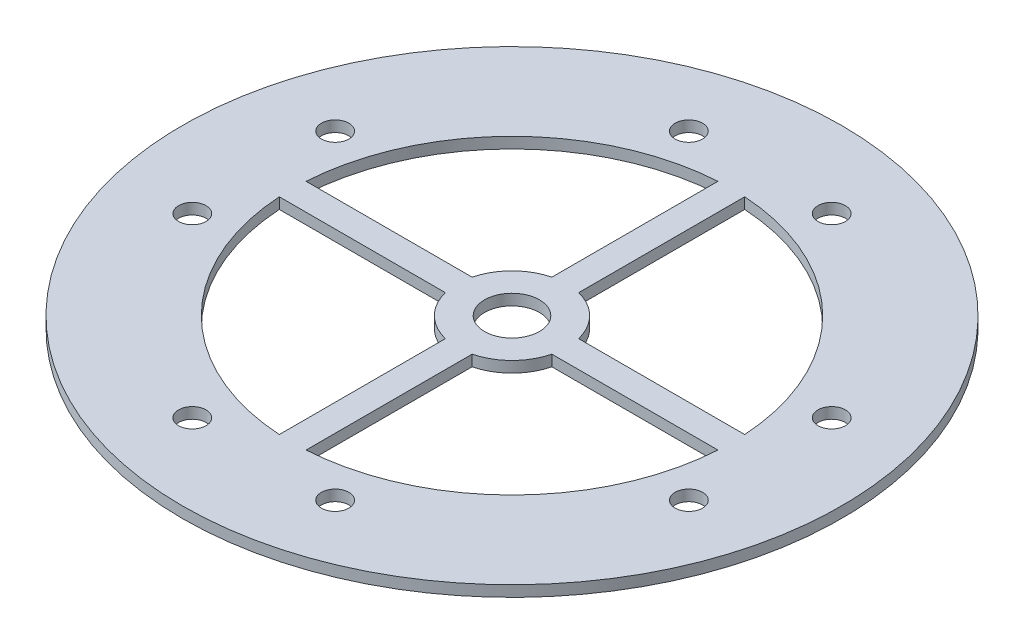
ISO-10303-21;
HEADER;
FILE_DESCRIPTION(('STEP AP214'),'2;1');
FILE_NAME('part.step','',(''),(''),'','','');
FILE_SCHEMA(('AUTOMOTIVE_DESIGN { 1 0 10303 214 1 1 1 1 }'));
ENDSEC;
DATA;
#1=APPLICATION_CONTEXT('core data for automotive mechanical design processes');
#2=APPLICATION_PROTOCOL_DEFINITION('international standard','automotive_design',2000,#1);
#3=PRODUCT_CONTEXT('',#1,'mechanical');
#4=PRODUCT('Part','Part','',(#3));
#5=PRODUCT_RELATED_PRODUCT_CATEGORY('part','',(#4));
#6=PRODUCT_DEFINITION_FORMATION('','',#4);
#7=PRODUCT_DEFINITION_CONTEXT('part definition',#1,'design');
#8=PRODUCT_DEFINITION('design','',#6,#7);
#9=PRODUCT_DEFINITION_SHAPE('','',#8);
#10=(LENGTH_UNIT() NAMED_UNIT(*) SI_UNIT(.MILLI.,.METRE.));
#11=(NAMED_UNIT(*) PLANE_ANGLE_UNIT() SI_UNIT($,.RADIAN.));
#12=(NAMED_UNIT(*) SI_UNIT($,.STERADIAN.) SOLID_ANGLE_UNIT());
#13=UNCERTAINTY_MEASURE_WITH_UNIT(LENGTH_MEASURE(1.E-05),#10,'distance_accuracy_value','');
#14=(GEOMETRIC_REPRESENTATION_CONTEXT(3) GLOBAL_UNCERTAINTY_ASSIGNED_CONTEXT((#13)) GLOBAL_UNIT_ASSIGNED_CONTEXT((#10,
#11,#12)) REPRESENTATION_CONTEXT('',''));
#15=CARTESIAN_POINT('',(0.,0.,0.));
#16=DIRECTION('',(0.,0.,1.));
#17=DIRECTION('',(1.,0.,0.));
#18=AXIS2_PLACEMENT_3D('',#15,#16,#17);
#19=CARTESIAN_POINT('',(0.,2.54,3.09938997051314));
#20=DIRECTION('',(0.,0.,1.));
#21=DIRECTION('',(1.,0.,0.));
#22=AXIS2_PLACEMENT_3D('',#19,#20,#21);
#23=PLANE('',#22);
#24=DIRECTION('',(-1.,0.,0.));
#25=VECTOR('',#24,1.);
#26=CARTESIAN_POINT('',(0.,0.,3.09938997051314));
#27=LINE('',#26,#25);
#28=CARTESIAN_POINT('',(-12.3159969880917,0.,3.09938997051301));
#29=VERTEX_POINT('',#28);
#30=CARTESIAN_POINT('',(-50.7053624561612,0.,3.09938997051261));
#31=VERTEX_POINT('',#30);
#32=EDGE_CURVE('E319',#29,#31,#27,.T.);
#33=ORIENTED_EDGE('',*,*,#32,.F.);
#34=DIRECTION('',(0.,-1.,0.));
#35=VECTOR('',#34,1.);
#36=CARTESIAN_POINT('',(-12.3159969880917,2.54,3.09938997051301));
#37=LINE('',#36,#35);
#38=CARTESIAN_POINT('',(-12.3159969880917,2.54,3.09938997051301));
#39=VERTEX_POINT('',#38);
#40=EDGE_CURVE('E11',#39,#29,#37,.T.);
#41=ORIENTED_EDGE('',*,*,#40,.F.);
#42=DIRECTION('',(-1.,0.,0.));
#43=VECTOR('',#42,1.);
#44=CARTESIAN_POINT('',(0.,2.54,3.09938997051314));
#45=LINE('',#44,#43);
#46=CARTESIAN_POINT('',(-50.7053624561612,2.54,3.09938997051261));
#47=VERTEX_POINT('',#46);
#48=EDGE_CURVE('E174',#39,#47,#45,.T.);
#49=ORIENTED_EDGE('',*,*,#48,.T.);
#50=DIRECTION('',(0.,-1.,0.));
#51=VECTOR('',#50,1.);
#52=CARTESIAN_POINT('',(-50.7053624561612,2.54,3.09938997051261));
#53=LINE('',#52,#51);
#54=EDGE_CURVE('E59',#47,#31,#53,.T.);
#55=ORIENTED_EDGE('',*,*,#54,.T.);
#56=EDGE_LOOP('',(#33,#41,#49,#55));
#57=FACE_BOUND('',#56,.T.);
#58=ADVANCED_FACE('F39',(#57),#23,.T.);
#59=CARTESIAN_POINT('',(0.,2.54,0.));
#60=DIRECTION('',(0.,-1.,0.));
#61=DIRECTION('',(0.,0.,-1.));
#62=AXIS2_PLACEMENT_3D('',#59,#60,#61);
#63=CYLINDRICAL_SURFACE('',#62,12.7);
#64=CARTESIAN_POINT('',(0.,0.,0.));
#65=DIRECTION('',(0.,1.,0.));
#66=DIRECTION('',(0.,0.,1.));
#67=AXIS2_PLACEMENT_3D('',#64,#65,#66);
#68=CIRCLE('',#67,12.7);
#69=CARTESIAN_POINT('',(-3.09938997051323,0.,12.3159969880916));
#70=VERTEX_POINT('',#69);
#71=EDGE_CURVE('E180',#29,#70,#68,.T.);
#72=ORIENTED_EDGE('',*,*,#71,.T.);
#73=DIRECTION('',(0.,-1.,0.));
#74=VECTOR('',#73,1.);
#75=CARTESIAN_POINT('',(-3.09938997051323,2.54,12.3159969880916));
#76=LINE('',#75,#74);
#77=CARTESIAN_POINT('',(-3.09938997051323,2.54,12.3159969880916));
#78=VERTEX_POINT('',#77);
#79=EDGE_CURVE('E50',#78,#70,#76,.T.);
#80=ORIENTED_EDGE('',*,*,#79,.F.);
#81=CARTESIAN_POINT('',(0.,2.54,0.));
#82=DIRECTION('',(0.,1.,0.));
#83=DIRECTION('',(0.,0.,1.));
#84=AXIS2_PLACEMENT_3D('',#81,#82,#83);
#85=CIRCLE('',#84,12.7);
#86=EDGE_CURVE('E169',#39,#78,#85,.T.);
#87=ORIENTED_EDGE('',*,*,#86,.F.);
#88=ORIENTED_EDGE('',*,*,#40,.T.);
#89=EDGE_LOOP('',(#72,#80,#87,#88));
#90=FACE_BOUND('',#89,.T.);
#91=ADVANCED_FACE('F178',(#90),#63,.T.);
#92=CARTESIAN_POINT('',(-3.0993899705137,2.54,1.1925598880297E-13));
#93=DIRECTION('',(1.,0.,0.));
#94=DIRECTION('',(0.,0.,-1.));
#95=AXIS2_PLACEMENT_3D('',#92,#93,#94);
#96=PLANE('',#95);
#97=DIRECTION('',(0.,0.,1.));
#98=VECTOR('',#97,1.);
#99=CARTESIAN_POINT('',(-3.0993899705137,0.,1.1925598880297E-13));
#100=LINE('',#99,#98);
#101=CARTESIAN_POINT('',(-3.09938997051175,0.,50.7053624561609));
#102=VERTEX_POINT('',#101);
#103=EDGE_CURVE('E324',#70,#102,#100,.T.);
#104=ORIENTED_EDGE('',*,*,#103,.T.);
#105=DIRECTION('',(0.,-1.,0.));
#106=VECTOR('',#105,1.);
#107=CARTESIAN_POINT('',(-3.09938997051175,2.54,50.7053624561609));
#108=LINE('',#107,#106);
#109=CARTESIAN_POINT('',(-3.09938997051175,2.54,50.7053624561609));
#110=VERTEX_POINT('',#109);
#111=EDGE_CURVE('E109',#110,#102,#108,.T.);
#112=ORIENTED_EDGE('',*,*,#111,.F.);
#113=DIRECTION('',(0.,0.,1.));
#114=VECTOR('',#113,1.);
#115=CARTESIAN_POINT('',(-3.0993899705137,2.54,1.1925598880297E-13));
#116=LINE('',#115,#114);
#117=EDGE_CURVE('E160',#78,#110,#116,.T.);
#118=ORIENTED_EDGE('',*,*,#117,.F.);
#119=ORIENTED_EDGE('',*,*,#79,.T.);
#120=EDGE_LOOP('',(#104,#112,#118,#119));
#121=FACE_BOUND('',#120,.T.);
#122=ADVANCED_FACE('F162',(#121),#96,.F.);
#123=CARTESIAN_POINT('',(0.,2.54,0.));
#124=DIRECTION('',(0.,-1.,0.));
#125=DIRECTION('',(0.,0.,-1.));
#126=AXIS2_PLACEMENT_3D('',#123,#124,#125);
#127=CYLINDRICAL_SURFACE('',#126,50.7999999999999);
#128=CARTESIAN_POINT('',(0.,0.,0.));
#129=DIRECTION('',(0.,1.,0.));
#130=DIRECTION('',(0.,0.,1.));
#131=AXIS2_PLACEMENT_3D('',#128,#129,#130);
#132=CIRCLE('',#131,50.7999999999999);
#133=CARTESIAN_POINT('',(3.09938997051453,0.,50.7053624561609));
#134=VERTEX_POINT('',#133);
#135=CARTESIAN_POINT('',(50.7053624561612,0.,3.09938997051332));
#136=VERTEX_POINT('',#135);
#137=EDGE_CURVE('E271',#134,#136,#132,.T.);
#138=ORIENTED_EDGE('',*,*,#137,.F.);
#139=DIRECTION('',(0.,-1.,0.));
#140=VECTOR('',#139,1.);
#141=CARTESIAN_POINT('',(3.09938997051453,2.54,50.7053624561609));
#142=LINE('',#141,#140);
#143=CARTESIAN_POINT('',(3.09938997051453,2.54,50.7053624561609));
#144=VERTEX_POINT('',#143);
#145=EDGE_CURVE('E198',#144,#134,#142,.T.);
#146=ORIENTED_EDGE('',*,*,#145,.F.);
#147=CARTESIAN_POINT('',(0.,2.54,0.));
#148=DIRECTION('',(0.,1.,0.));
#149=DIRECTION('',(0.,0.,1.));
#150=AXIS2_PLACEMENT_3D('',#147,#148,#149);
#151=CIRCLE('',#150,50.7999999999999);
#152=CARTESIAN_POINT('',(50.7053624561612,2.54,3.09938997051332));
#153=VERTEX_POINT('',#152);
#154=EDGE_CURVE('E370',#144,#153,#151,.T.);
#155=ORIENTED_EDGE('',*,*,#154,.T.);
#156=DIRECTION('',(0.,-1.,0.));
#157=VECTOR('',#156,1.);
#158=CARTESIAN_POINT('',(50.7053624561612,2.54,3.09938997051332));
#159=LINE('',#158,#157);
#160=EDGE_CURVE('E187',#153,#136,#159,.T.);
#161=ORIENTED_EDGE('',*,*,#160,.T.);
#162=EDGE_LOOP('',(#138,#146,#155,#161));
#163=FACE_BOUND('',#162,.T.);
#164=ADVANCED_FACE('F495',(#163),#127,.F.);
#165=CARTESIAN_POINT('',(3.09938997051258,2.54,-1.19255988802927E-13));
#166=DIRECTION('',(1.,0.,0.));
#167=DIRECTION('',(0.,0.,-1.));
#168=AXIS2_PLACEMENT_3D('',#165,#166,#167);
#169=PLANE('',#168);
#170=DIRECTION('',(0.,0.,1.));
#171=VECTOR('',#170,1.);
#172=CARTESIAN_POINT('',(3.09938997051258,0.,-1.19255988802927E-13));
#173=LINE('',#172,#171);
#174=CARTESIAN_POINT('',(3.09938997051305,0.,12.3159969880917));
#175=VERTEX_POINT('',#174);
#176=EDGE_CURVE('E275',#175,#134,#173,.T.);
#177=ORIENTED_EDGE('',*,*,#176,.F.);
#178=DIRECTION('',(0.,-1.,0.));
#179=VECTOR('',#178,1.);
#180=CARTESIAN_POINT('',(3.09938997051305,2.54,12.3159969880917));
#181=LINE('',#180,#179);
#182=CARTESIAN_POINT('',(3.09938997051305,2.54,12.3159969880917));
#183=VERTEX_POINT('',#182);
#184=EDGE_CURVE('E195',#183,#175,#181,.T.);
#185=ORIENTED_EDGE('',*,*,#184,.F.);
#186=DIRECTION('',(0.,0.,1.));
#187=VECTOR('',#186,1.);
#188=CARTESIAN_POINT('',(3.09938997051258,2.54,-1.19255988802927E-13));
#189=LINE('',#188,#187);
#190=EDGE_CURVE('E374',#183,#144,#189,.T.);
#191=ORIENTED_EDGE('',*,*,#190,.T.);
#192=ORIENTED_EDGE('',*,*,#145,.T.);
#193=EDGE_LOOP('',(#177,#185,#191,#192));
#194=FACE_BOUND('',#193,.T.);
#195=ADVANCED_FACE('F491',(#194),#169,.T.);
#196=CARTESIAN_POINT('',(0.,2.54,0.));
#197=DIRECTION('',(0.,-1.,0.));
#198=DIRECTION('',(0.,0.,-1.));
#199=AXIS2_PLACEMENT_3D('',#196,#197,#198);
#200=CYLINDRICAL_SURFACE('',#199,12.7);
#201=CARTESIAN_POINT('',(0.,0.,0.));
#202=DIRECTION('',(0.,1.,0.));
#203=DIRECTION('',(0.,0.,1.));
#204=AXIS2_PLACEMENT_3D('',#201,#202,#203);
#205=CIRCLE('',#204,12.7);
#206=CARTESIAN_POINT('',(12.3159969880916,0.,3.09938997051318));
#207=VERTEX_POINT('',#206);
#208=EDGE_CURVE('E279',#175,#207,#205,.T.);
#209=ORIENTED_EDGE('',*,*,#208,.T.);
#210=DIRECTION('',(0.,-1.,0.));
#211=VECTOR('',#210,1.);
#212=CARTESIAN_POINT('',(12.3159969880916,2.54,3.09938997051318));
#213=LINE('',#212,#211);
#214=CARTESIAN_POINT('',(12.3159969880916,2.54,3.09938997051318));
#215=VERTEX_POINT('',#214);
#216=EDGE_CURVE('E190',#215,#207,#213,.T.);
#217=ORIENTED_EDGE('',*,*,#216,.F.);
#218=CARTESIAN_POINT('',(0.,2.54,0.));
#219=DIRECTION('',(0.,1.,0.));
#220=DIRECTION('',(0.,0.,1.));
#221=AXIS2_PLACEMENT_3D('',#218,#219,#220);
#222=CIRCLE('',#221,12.7);
#223=EDGE_CURVE('E378',#183,#215,#222,.T.);
#224=ORIENTED_EDGE('',*,*,#223,.F.);
#225=ORIENTED_EDGE('',*,*,#184,.T.);
#226=EDGE_LOOP('',(#209,#217,#224,#225));
#227=FACE_BOUND('',#226,.T.);
#228=ADVANCED_FACE('F487',(#227),#200,.T.);
#229=CARTESIAN_POINT('',(0.,2.54,0.));
#230=DIRECTION('',(0.,-1.,0.));
#231=DIRECTION('',(0.,0.,-1.));
#232=AXIS2_PLACEMENT_3D('',#229,#230,#231);
#233=CYLINDRICAL_SURFACE('',#232,50.8);
#234=CARTESIAN_POINT('',(0.,0.,0.));
#235=DIRECTION('',(0.,1.,0.));
#236=DIRECTION('',(0.,0.,1.));
#237=AXIS2_PLACEMENT_3D('',#234,#235,#236);
#238=CIRCLE('',#237,50.8);
#239=CARTESIAN_POINT('',(50.7053624561612,0.,-3.09938997051296));
#240=VERTEX_POINT('',#239);
#241=CARTESIAN_POINT('',(3.09938997051314,0.,-50.7053624561612));
#242=VERTEX_POINT('',#241);
#243=EDGE_CURVE('E255',#240,#242,#238,.T.);
#244=ORIENTED_EDGE('',*,*,#243,.F.);
#245=DIRECTION('',(0.,-1.,0.));
#246=VECTOR('',#245,1.);
#247=CARTESIAN_POINT('',(50.7053624561612,2.54,-3.09938997051296));
#248=LINE('',#247,#246);
#249=CARTESIAN_POINT('',(50.7053624561612,2.54,-3.09938997051296));
#250=VERTEX_POINT('',#249);
#251=EDGE_CURVE('E191',#250,#240,#248,.T.);
#252=ORIENTED_EDGE('',*,*,#251,.F.);
#253=CARTESIAN_POINT('',(0.,2.54,0.));
#254=DIRECTION('',(0.,1.,0.));
#255=DIRECTION('',(0.,0.,1.));
#256=AXIS2_PLACEMENT_3D('',#253,#254,#255);
#257=CIRCLE('',#256,50.8);
#258=CARTESIAN_POINT('',(3.09938997051314,2.54,-50.7053624561612));
#259=VERTEX_POINT('',#258);
#260=EDGE_CURVE('E355',#250,#259,#257,.T.);
#261=ORIENTED_EDGE('',*,*,#260,.T.);
#262=DIRECTION('',(0.,-1.,0.));
#263=VECTOR('',#262,1.);
#264=CARTESIAN_POINT('',(3.09938997051314,2.54,-50.7053624561612));
#265=LINE('',#264,#263);
#266=EDGE_CURVE('E201',#259,#242,#265,.T.);
#267=ORIENTED_EDGE('',*,*,#266,.T.);
#268=EDGE_LOOP('',(#244,#252,#261,#267));
#269=FACE_BOUND('',#268,.T.);
#270=ADVANCED_FACE('F490',(#269),#233,.F.);
#271=CARTESIAN_POINT('',(0.,2.54,-3.09938997051314));
#272=DIRECTION('',(0.,0.,-1.));
#273=DIRECTION('',(-1.,0.,0.));
#274=AXIS2_PLACEMENT_3D('',#271,#272,#273);
#275=PLANE('',#274);
#276=DIRECTION('',(1.,0.,0.));
#277=VECTOR('',#276,1.);
#278=CARTESIAN_POINT('',(0.,0.,-3.09938997051314));
#279=LINE('',#278,#277);
#280=CARTESIAN_POINT('',(12.3159969880917,0.,-3.0993899705131));
#281=VERTEX_POINT('',#280);
#282=EDGE_CURVE('E259',#281,#240,#279,.T.);
#283=ORIENTED_EDGE('',*,*,#282,.F.);
#284=DIRECTION('',(0.,-1.,0.));
#285=VECTOR('',#284,1.);
#286=CARTESIAN_POINT('',(12.3159969880917,2.54,-3.0993899705131));
#287=LINE('',#286,#285);
#288=CARTESIAN_POINT('',(12.3159969880917,2.54,-3.0993899705131));
#289=VERTEX_POINT('',#288);
#290=EDGE_CURVE('E208',#289,#281,#287,.T.);
#291=ORIENTED_EDGE('',*,*,#290,.F.);
#292=DIRECTION('',(1.,0.,0.));
#293=VECTOR('',#292,1.);
#294=CARTESIAN_POINT('',(0.,2.54,-3.09938997051314));
#295=LINE('',#294,#293);
#296=EDGE_CURVE('E359',#289,#250,#295,.T.);
#297=ORIENTED_EDGE('',*,*,#296,.T.);
#298=ORIENTED_EDGE('',*,*,#251,.T.);
#299=EDGE_LOOP('',(#283,#291,#297,#298));
#300=FACE_BOUND('',#299,.T.);
#301=ADVANCED_FACE('F506',(#300),#275,.T.);
#302=CARTESIAN_POINT('',(0.,2.54,0.));
#303=DIRECTION('',(0.,-1.,0.));
#304=DIRECTION('',(0.,0.,-1.));
#305=AXIS2_PLACEMENT_3D('',#302,#303,#304);
#306=CYLINDRICAL_SURFACE('',#305,12.7);
#307=CARTESIAN_POINT('',(0.,0.,0.));
#308=DIRECTION('',(0.,1.,0.));
#309=DIRECTION('',(0.,0.,1.));
#310=AXIS2_PLACEMENT_3D('',#307,#308,#309);
#311=CIRCLE('',#310,12.7);
#312=CARTESIAN_POINT('',(3.09938997051314,0.,-12.3159969880916));
#313=VERTEX_POINT('',#312);
#314=EDGE_CURVE('E263',#281,#313,#311,.T.);
#315=ORIENTED_EDGE('',*,*,#314,.T.);
#316=DIRECTION('',(0.,-1.,0.));
#317=VECTOR('',#316,1.);
#318=CARTESIAN_POINT('',(3.09938997051314,2.54,-12.3159969880916));
#319=LINE('',#318,#317);
#320=CARTESIAN_POINT('',(3.09938997051314,2.54,-12.3159969880916));
#321=VERTEX_POINT('',#320);
#322=EDGE_CURVE('E204',#321,#313,#319,.T.);
#323=ORIENTED_EDGE('',*,*,#322,.F.);
#324=CARTESIAN_POINT('',(0.,2.54,0.));
#325=DIRECTION('',(0.,1.,0.));
#326=DIRECTION('',(0.,0.,1.));
#327=AXIS2_PLACEMENT_3D('',#324,#325,#326);
#328=CIRCLE('',#327,12.7);
#329=EDGE_CURVE('E363',#289,#321,#328,.T.);
#330=ORIENTED_EDGE('',*,*,#329,.F.);
#331=ORIENTED_EDGE('',*,*,#290,.T.);
#332=EDGE_LOOP('',(#315,#323,#330,#331));
#333=FACE_BOUND('',#332,.T.);
#334=ADVANCED_FACE('F503',(#333),#306,.T.);
#335=CARTESIAN_POINT('',(0.,2.54,0.));
#336=DIRECTION('',(0.,-1.,0.));
#337=DIRECTION('',(0.,0.,-1.));
#338=AXIS2_PLACEMENT_3D('',#335,#336,#337);
#339=CYLINDRICAL_SURFACE('',#338,50.8);
#340=CARTESIAN_POINT('',(0.,0.,0.));
#341=DIRECTION('',(0.,1.,0.));
#342=DIRECTION('',(0.,0.,1.));
#343=AXIS2_PLACEMENT_3D('',#340,#341,#342);
#344=CIRCLE('',#343,50.8);
#345=CARTESIAN_POINT('',(-3.09938997051314,0.,-50.7053624561612));
#346=VERTEX_POINT('',#345);
#347=CARTESIAN_POINT('',(-50.7053624561612,0.,-3.09938997051367));
#348=VERTEX_POINT('',#347);
#349=EDGE_CURVE('E235',#346,#348,#344,.T.);
#350=ORIENTED_EDGE('',*,*,#349,.F.);
#351=DIRECTION('',(0.,-1.,0.));
#352=VECTOR('',#351,1.);
#353=CARTESIAN_POINT('',(-3.09938997051314,2.54,-50.7053624561612));
#354=LINE('',#353,#352);
#355=CARTESIAN_POINT('',(-3.09938997051314,2.54,-50.7053624561612));
#356=VERTEX_POINT('',#355);
#357=EDGE_CURVE('E43',#356,#346,#354,.T.);
#358=ORIENTED_EDGE('',*,*,#357,.F.);
#359=CARTESIAN_POINT('',(0.,2.54,0.));
#360=DIRECTION('',(0.,1.,0.));
#361=DIRECTION('',(0.,0.,1.));
#362=AXIS2_PLACEMENT_3D('',#359,#360,#361);
#363=CIRCLE('',#362,50.8);
#364=CARTESIAN_POINT('',(-50.7053624561612,2.54,-3.09938997051367));
#365=VERTEX_POINT('',#364);
#366=EDGE_CURVE('E341',#356,#365,#363,.T.);
#367=ORIENTED_EDGE('',*,*,#366,.T.);
#368=DIRECTION('',(0.,-1.,0.));
#369=VECTOR('',#368,1.);
#370=CARTESIAN_POINT('',(-50.7053624561612,2.54,-3.09938997051367));
#371=LINE('',#370,#369);
#372=EDGE_CURVE('E213',#365,#348,#371,.T.);
#373=ORIENTED_EDGE('',*,*,#372,.T.);
#374=EDGE_LOOP('',(#350,#358,#367,#373));
#375=FACE_BOUND('',#374,.T.);
#376=ADVANCED_FACE('F236',(#375),#339,.F.);
#377=CARTESIAN_POINT('',(-3.09938997051314,2.54,0.));
#378=DIRECTION('',(-1.,0.,0.));
#379=DIRECTION('',(0.,0.,1.));
#380=AXIS2_PLACEMENT_3D('',#377,#378,#379);
#381=PLANE('',#380);
#382=DIRECTION('',(0.,0.,-1.));
#383=VECTOR('',#382,1.);
#384=CARTESIAN_POINT('',(-3.09938997051314,0.,0.));
#385=LINE('',#384,#383);
#386=CARTESIAN_POINT('',(-3.09938997051314,0.,-12.3159969880916));
#387=VERTEX_POINT('',#386);
#388=EDGE_CURVE('E231',#387,#346,#385,.T.);
#389=ORIENTED_EDGE('',*,*,#388,.F.);
#390=DIRECTION('',(0.,-1.,0.));
#391=VECTOR('',#390,1.);
#392=CARTESIAN_POINT('',(-3.09938997051314,2.54,-12.3159969880916));
#393=LINE('',#392,#391);
#394=CARTESIAN_POINT('',(-3.09938997051314,2.54,-12.3159969880916));
#395=VERTEX_POINT('',#394);
#396=EDGE_CURVE('E219',#395,#387,#393,.T.);
#397=ORIENTED_EDGE('',*,*,#396,.F.);
#398=DIRECTION('',(0.,0.,-1.));
#399=VECTOR('',#398,1.);
#400=CARTESIAN_POINT('',(-3.09938997051314,2.54,0.));
#401=LINE('',#400,#399);
#402=EDGE_CURVE('E233',#395,#356,#401,.T.);
#403=ORIENTED_EDGE('',*,*,#402,.T.);
#404=ORIENTED_EDGE('',*,*,#357,.T.);
#405=EDGE_LOOP('',(#389,#397,#403,#404));
#406=FACE_BOUND('',#405,.T.);
#407=ADVANCED_FACE('F229',(#406),#381,.T.);
#408=CARTESIAN_POINT('',(0.,2.54,0.));
#409=DIRECTION('',(0.,-1.,0.));
#410=DIRECTION('',(0.,0.,-1.));
#411=AXIS2_PLACEMENT_3D('',#408,#409,#410);
#412=CYLINDRICAL_SURFACE('',#411,12.7);
#413=CARTESIAN_POINT('',(0.,0.,0.));
#414=DIRECTION('',(0.,1.,0.));
#415=DIRECTION('',(0.,0.,1.));
#416=AXIS2_PLACEMENT_3D('',#413,#414,#415);
#417=CIRCLE('',#416,12.7);
#418=CARTESIAN_POINT('',(-12.3159969880916,0.,-3.09938997051327));
#419=VERTEX_POINT('',#418);
#420=EDGE_CURVE('E245',#387,#419,#417,.T.);
#421=ORIENTED_EDGE('',*,*,#420,.T.);
#422=DIRECTION('',(0.,-1.,0.));
#423=VECTOR('',#422,1.);
#424=CARTESIAN_POINT('',(-12.3159969880916,2.54,-3.09938997051327));
#425=LINE('',#424,#423);
#426=CARTESIAN_POINT('',(-12.3159969880916,2.54,-3.09938997051327));
#427=VERTEX_POINT('',#426);
#428=EDGE_CURVE('E216',#427,#419,#425,.T.);
#429=ORIENTED_EDGE('',*,*,#428,.F.);
#430=CARTESIAN_POINT('',(0.,2.54,0.));
#431=DIRECTION('',(0.,1.,0.));
#432=DIRECTION('',(0.,0.,1.));
#433=AXIS2_PLACEMENT_3D('',#430,#431,#432);
#434=CIRCLE('',#433,12.7);
#435=EDGE_CURVE('E348',#395,#427,#434,.T.);
#436=ORIENTED_EDGE('',*,*,#435,.F.);
#437=ORIENTED_EDGE('',*,*,#396,.T.);
#438=EDGE_LOOP('',(#421,#429,#436,#437));
#439=FACE_BOUND('',#438,.T.);
#440=ADVANCED_FACE('F454',(#439),#412,.T.);
#441=CARTESIAN_POINT('',(0.,2.54,0.));
#442=DIRECTION('',(0.,-1.,0.));
#443=DIRECTION('',(0.,0.,-1.));
#444=AXIS2_PLACEMENT_3D('',#441,#442,#443);
#445=CYLINDRICAL_SURFACE('',#444,76.2);
#446=CARTESIAN_POINT('',(0.,2.54,0.));
#447=DIRECTION('',(0.,1.,0.));
#448=DIRECTION('',(0.,0.,1.));
#449=AXIS2_PLACEMENT_3D('',#446,#447,#448);
#450=CIRCLE('',#449,76.2);
#451=CARTESIAN_POINT('',(0.,2.54,76.2));
#452=VERTEX_POINT('',#451);
#453=EDGE_CURVE('E413',#452,#452,#450,.T.);
#454=ORIENTED_EDGE('',*,*,#453,.F.);
#455=EDGE_LOOP('',(#454));
#456=FACE_BOUND('',#455,.T.);
#457=CARTESIAN_POINT('',(0.,0.,0.));
#458=DIRECTION('',(0.,1.,0.));
#459=DIRECTION('',(0.,0.,1.));
#460=AXIS2_PLACEMENT_3D('',#457,#458,#459);
#461=CIRCLE('',#460,76.2);
#462=CARTESIAN_POINT('',(0.,0.,76.2));
#463=VERTEX_POINT('',#462);
#464=EDGE_CURVE('E315',#463,#463,#461,.T.);
#465=ORIENTED_EDGE('',*,*,#464,.T.);
#466=EDGE_LOOP('',(#465));
#467=FACE_BOUND('',#466,.T.);
#468=ADVANCED_FACE('F450',(#456,#467),#445,.T.);
#469=CARTESIAN_POINT('',(57.4040000000042,2.54,16.5099999999977));
#470=DIRECTION('',(0.,-1.,0.));
#471=DIRECTION('',(0.,0.,-1.));
#472=AXIS2_PLACEMENT_3D('',#469,#470,#471);
#473=CYLINDRICAL_SURFACE('',#472,3.17500000000117);
#474=CARTESIAN_POINT('',(57.4040000000042,2.54,16.5099999999977));
#475=DIRECTION('',(0.,1.,0.));
#476=DIRECTION('',(0.,0.,1.));
#477=AXIS2_PLACEMENT_3D('',#474,#475,#476);
#478=CIRCLE('',#477,3.17500000000117);
#479=CARTESIAN_POINT('',(57.4040000000042,2.54,19.6849999999989));
#480=VERTEX_POINT('',#479);
#481=EDGE_CURVE('E409',#480,#480,#478,.T.);
#482=ORIENTED_EDGE('',*,*,#481,.T.);
#483=EDGE_LOOP('',(#482));
#484=FACE_BOUND('',#483,.T.);
#485=CARTESIAN_POINT('',(57.4040000000042,0.,16.5099999999977));
#486=DIRECTION('',(0.,1.,0.));
#487=DIRECTION('',(0.,0.,1.));
#488=AXIS2_PLACEMENT_3D('',#485,#486,#487);
#489=CIRCLE('',#488,3.17500000000117);
#490=CARTESIAN_POINT('',(57.4040000000042,0.,19.6849999999989));
#491=VERTEX_POINT('',#490);
#492=EDGE_CURVE('E311',#491,#491,#489,.T.);
#493=ORIENTED_EDGE('',*,*,#492,.F.);
#494=EDGE_LOOP('',(#493));
#495=FACE_BOUND('',#494,.T.);
#496=ADVANCED_FACE('F453',(#484,#495),#473,.F.);
#497=CARTESIAN_POINT('',(57.4040000000042,2.54,-16.5100000000023));
#498=DIRECTION('',(0.,-1.,0.));
#499=DIRECTION('',(0.,0.,-1.));
#500=AXIS2_PLACEMENT_3D('',#497,#498,#499);
#501=CYLINDRICAL_SURFACE('',#500,3.1750000000012);
#502=CARTESIAN_POINT('',(57.4040000000042,2.54,-16.5100000000023));
#503=DIRECTION('',(0.,1.,0.));
#504=DIRECTION('',(0.,0.,1.));
#505=AXIS2_PLACEMENT_3D('',#502,#503,#504);
#506=CIRCLE('',#505,3.1750000000012);
#507=CARTESIAN_POINT('',(57.4040000000042,2.54,-13.3350000000011));
#508=VERTEX_POINT('',#507);
#509=EDGE_CURVE('E405',#508,#508,#506,.T.);
#510=ORIENTED_EDGE('',*,*,#509,.T.);
#511=EDGE_LOOP('',(#510));
#512=FACE_BOUND('',#511,.T.);
#513=CARTESIAN_POINT('',(57.4040000000042,0.,-16.5100000000023));
#514=DIRECTION('',(0.,1.,0.));
#515=DIRECTION('',(0.,0.,1.));
#516=AXIS2_PLACEMENT_3D('',#513,#514,#515);
#517=CIRCLE('',#516,3.1750000000012);
#518=CARTESIAN_POINT('',(57.4040000000042,0.,-13.3350000000011));
#519=VERTEX_POINT('',#518);
#520=EDGE_CURVE('E307',#519,#519,#517,.T.);
#521=ORIENTED_EDGE('',*,*,#520,.F.);
#522=EDGE_LOOP('',(#521));
#523=FACE_BOUND('',#522,.T.);
#524=ADVANCED_FACE('F458',(#512,#523),#501,.F.);
#525=CARTESIAN_POINT('',(-16.5099999999935,2.54,57.4040000000019));
#526=DIRECTION('',(0.,-1.,0.));
#527=DIRECTION('',(0.,0.,-1.));
#528=AXIS2_PLACEMENT_3D('',#525,#526,#527);
#529=CYLINDRICAL_SURFACE('',#528,3.17500000000603);
#530=CARTESIAN_POINT('',(-16.5099999999935,2.54,57.4040000000019));
#531=DIRECTION('',(0.,1.,0.));
#532=DIRECTION('',(0.,0.,1.));
#533=AXIS2_PLACEMENT_3D('',#530,#531,#532);
#534=CIRCLE('',#533,3.17500000000603);
#535=CARTESIAN_POINT('',(-16.5099999999935,2.54,60.5790000000079));
#536=VERTEX_POINT('',#535);
#537=EDGE_CURVE('E401',#536,#536,#534,.T.);
#538=ORIENTED_EDGE('',*,*,#537,.T.);
#539=EDGE_LOOP('',(#538));
#540=FACE_BOUND('',#539,.T.);
#541=CARTESIAN_POINT('',(-16.5099999999935,0.,57.4040000000019));
#542=DIRECTION('',(0.,1.,0.));
#543=DIRECTION('',(0.,0.,1.));
#544=AXIS2_PLACEMENT_3D('',#541,#542,#543);
#545=CIRCLE('',#544,3.17500000000603);
#546=CARTESIAN_POINT('',(-16.5099999999935,0.,60.5790000000079));
#547=VERTEX_POINT('',#546);
#548=EDGE_CURVE('E303',#547,#547,#545,.T.);
#549=ORIENTED_EDGE('',*,*,#548,.F.);
#550=EDGE_LOOP('',(#549));
#551=FACE_BOUND('',#550,.T.);
#552=ADVANCED_FACE('F462',(#540,#551),#529,.F.);
#553=CARTESIAN_POINT('',(16.5100000000065,2.54,57.4040000000019));
#554=DIRECTION('',(0.,-1.,0.));
#555=DIRECTION('',(0.,0.,-1.));
#556=AXIS2_PLACEMENT_3D('',#553,#554,#555);
#557=CYLINDRICAL_SURFACE('',#556,3.1750000000061);
#558=CARTESIAN_POINT('',(16.5100000000065,2.54,57.4040000000019));
#559=DIRECTION('',(0.,1.,0.));
#560=DIRECTION('',(0.,0.,1.));
#561=AXIS2_PLACEMENT_3D('',#558,#559,#560);
#562=CIRCLE('',#561,3.1750000000061);
#563=CARTESIAN_POINT('',(16.5100000000065,2.54,60.579000000008));
#564=VERTEX_POINT('',#563);
#565=EDGE_CURVE('E397',#564,#564,#562,.T.);
#566=ORIENTED_EDGE('',*,*,#565,.T.);
#567=EDGE_LOOP('',(#566));
#568=FACE_BOUND('',#567,.T.);
#569=CARTESIAN_POINT('',(16.5100000000065,0.,57.4040000000019));
#570=DIRECTION('',(0.,1.,0.));
#571=DIRECTION('',(0.,0.,1.));
#572=AXIS2_PLACEMENT_3D('',#569,#570,#571);
#573=CIRCLE('',#572,3.1750000000061);
#574=CARTESIAN_POINT('',(16.5100000000065,0.,60.579000000008));
#575=VERTEX_POINT('',#574);
#576=EDGE_CURVE('E299',#575,#575,#573,.T.);
#577=ORIENTED_EDGE('',*,*,#576,.F.);
#578=EDGE_LOOP('',(#577));
#579=FACE_BOUND('',#578,.T.);
#580=ADVANCED_FACE('F466',(#568,#579),#557,.F.);
#581=CARTESIAN_POINT('',(-57.4039999999977,2.54,-16.5099999999958));
#582=DIRECTION('',(0.,-1.,0.));
#583=DIRECTION('',(0.,0.,-1.));
#584=AXIS2_PLACEMENT_3D('',#581,#582,#583);
#585=CYLINDRICAL_SURFACE('',#584,3.17500000000522);
#586=CARTESIAN_POINT('',(-57.4039999999977,2.54,-16.5099999999958));
#587=DIRECTION('',(0.,1.,0.));
#588=DIRECTION('',(0.,0.,1.));
#589=AXIS2_PLACEMENT_3D('',#586,#587,#588);
#590=CIRCLE('',#589,3.17500000000522);
#591=CARTESIAN_POINT('',(-57.4039999999977,2.54,-13.3349999999906));
#592=VERTEX_POINT('',#591);
#593=EDGE_CURVE('E393',#592,#592,#590,.T.);
#594=ORIENTED_EDGE('',*,*,#593,.T.);
#595=EDGE_LOOP('',(#594));
#596=FACE_BOUND('',#595,.T.);
#597=CARTESIAN_POINT('',(-57.4039999999977,0.,-16.5099999999958));
#598=DIRECTION('',(0.,1.,0.));
#599=DIRECTION('',(0.,0.,1.));
#600=AXIS2_PLACEMENT_3D('',#597,#598,#599);
#601=CIRCLE('',#600,3.17500000000522);
#602=CARTESIAN_POINT('',(-57.4039999999977,0.,-13.3349999999906));
#603=VERTEX_POINT('',#602);
#604=EDGE_CURVE('E295',#603,#603,#601,.T.);
#605=ORIENTED_EDGE('',*,*,#604,.F.);
#606=EDGE_LOOP('',(#605));
#607=FACE_BOUND('',#606,.T.);
#608=ADVANCED_FACE('F470',(#596,#607),#585,.F.);
#609=CARTESIAN_POINT('',(-57.4039999999977,2.54,16.5100000000042));
#610=DIRECTION('',(0.,-1.,0.));
#611=DIRECTION('',(0.,0.,-1.));
#612=AXIS2_PLACEMENT_3D('',#609,#610,#611);
#613=CYLINDRICAL_SURFACE('',#612,3.17500000000532);
#614=CARTESIAN_POINT('',(-57.4039999999977,2.54,16.5100000000042));
#615=DIRECTION('',(0.,1.,0.));
#616=DIRECTION('',(0.,0.,1.));
#617=AXIS2_PLACEMENT_3D('',#614,#615,#616);
#618=CIRCLE('',#617,3.17500000000532);
#619=CARTESIAN_POINT('',(-57.4039999999977,2.54,19.6850000000095));
#620=VERTEX_POINT('',#619);
#621=EDGE_CURVE('E389',#620,#620,#618,.T.);
#622=ORIENTED_EDGE('',*,*,#621,.T.);
#623=EDGE_LOOP('',(#622));
#624=FACE_BOUND('',#623,.T.);
#625=CARTESIAN_POINT('',(-57.4039999999977,0.,16.5100000000042));
#626=DIRECTION('',(0.,1.,0.));
#627=DIRECTION('',(0.,0.,1.));
#628=AXIS2_PLACEMENT_3D('',#625,#626,#627);
#629=CIRCLE('',#628,3.17500000000532);
#630=CARTESIAN_POINT('',(-57.4039999999977,0.,19.6850000000095));
#631=VERTEX_POINT('',#630);
#632=EDGE_CURVE('E291',#631,#631,#629,.T.);
#633=ORIENTED_EDGE('',*,*,#632,.F.);
#634=EDGE_LOOP('',(#633));
#635=FACE_BOUND('',#634,.T.);
#636=ADVANCED_FACE('F474',(#624,#635),#613,.F.);
#637=CARTESIAN_POINT('',(0.,2.54,0.));
#638=DIRECTION('',(0.,-1.,0.));
#639=DIRECTION('',(0.,0.,-1.));
#640=AXIS2_PLACEMENT_3D('',#637,#638,#639);
#641=CYLINDRICAL_SURFACE('',#640,6.35);
#642=CARTESIAN_POINT('',(0.,2.54,0.));
#643=DIRECTION('',(0.,1.,0.));
#644=DIRECTION('',(0.,0.,1.));
#645=AXIS2_PLACEMENT_3D('',#642,#643,#644);
#646=CIRCLE('',#645,6.35);
#647=CARTESIAN_POINT('',(0.,2.54,6.35));
#648=VERTEX_POINT('',#647);
#649=EDGE_CURVE('E385',#648,#648,#646,.T.);
#650=ORIENTED_EDGE('',*,*,#649,.T.);
#651=EDGE_LOOP('',(#650));
#652=FACE_BOUND('',#651,.T.);
#653=CARTESIAN_POINT('',(0.,0.,0.));
#654=DIRECTION('',(0.,1.,0.));
#655=DIRECTION('',(0.,0.,1.));
#656=AXIS2_PLACEMENT_3D('',#653,#654,#655);
#657=CIRCLE('',#656,6.35);
#658=CARTESIAN_POINT('',(0.,0.,6.35));
#659=VERTEX_POINT('',#658);
#660=EDGE_CURVE('E287',#659,#659,#657,.T.);
#661=ORIENTED_EDGE('',*,*,#660,.F.);
#662=EDGE_LOOP('',(#661));
#663=FACE_BOUND('',#662,.T.);
#664=ADVANCED_FACE('F478',(#652,#663),#641,.F.);
#665=CARTESIAN_POINT('',(0.,2.54,3.09938997051314));
#666=DIRECTION('',(0.,0.,-1.));
#667=DIRECTION('',(-1.,0.,0.));
#668=AXIS2_PLACEMENT_3D('',#665,#666,#667);
#669=PLANE('',#668);
#670=DIRECTION('',(1.,0.,0.));
#671=VECTOR('',#670,1.);
#672=CARTESIAN_POINT('',(0.,0.,3.09938997051314));
#673=LINE('',#672,#671);
#674=EDGE_CURVE('E283',#207,#136,#673,.T.);
#675=ORIENTED_EDGE('',*,*,#674,.T.);
#676=ORIENTED_EDGE('',*,*,#160,.F.);
#677=DIRECTION('',(1.,0.,0.));
#678=VECTOR('',#677,1.);
#679=CARTESIAN_POINT('',(0.,2.54,3.09938997051314));
#680=LINE('',#679,#678);
#681=EDGE_CURVE('E382',#215,#153,#680,.T.);
#682=ORIENTED_EDGE('',*,*,#681,.F.);
#683=ORIENTED_EDGE('',*,*,#216,.T.);
#684=EDGE_LOOP('',(#675,#676,#682,#683));
#685=FACE_BOUND('',#684,.T.);
#686=ADVANCED_FACE('F482',(#685),#669,.F.);
#687=CARTESIAN_POINT('',(3.09938997051314,2.54,0.));
#688=DIRECTION('',(-1.,0.,0.));
#689=DIRECTION('',(0.,0.,1.));
#690=AXIS2_PLACEMENT_3D('',#687,#688,#689);
#691=PLANE('',#690);
#692=DIRECTION('',(0.,0.,-1.));
#693=VECTOR('',#692,1.);
#694=CARTESIAN_POINT('',(3.09938997051314,0.,0.));
#695=LINE('',#694,#693);
#696=EDGE_CURVE('E267',#313,#242,#695,.T.);
#697=ORIENTED_EDGE('',*,*,#696,.T.);
#698=ORIENTED_EDGE('',*,*,#266,.F.);
#699=DIRECTION('',(0.,0.,-1.));
#700=VECTOR('',#699,1.);
#701=CARTESIAN_POINT('',(3.09938997051314,2.54,0.));
#702=LINE('',#701,#700);
#703=EDGE_CURVE('E367',#321,#259,#702,.T.);
#704=ORIENTED_EDGE('',*,*,#703,.F.);
#705=ORIENTED_EDGE('',*,*,#322,.T.);
#706=EDGE_LOOP('',(#697,#698,#704,#705));
#707=FACE_BOUND('',#706,.T.);
#708=ADVANCED_FACE('F438',(#707),#691,.F.);
#709=CARTESIAN_POINT('',(0.,2.54,-3.09938997051314));
#710=DIRECTION('',(0.,0.,1.));
#711=DIRECTION('',(1.,0.,0.));
#712=AXIS2_PLACEMENT_3D('',#709,#710,#711);
#713=PLANE('',#712);
#714=DIRECTION('',(-1.,0.,0.));
#715=VECTOR('',#714,1.);
#716=CARTESIAN_POINT('',(0.,0.,-3.09938997051314));
#717=LINE('',#716,#715);
#718=EDGE_CURVE('E249',#419,#348,#717,.T.);
#719=ORIENTED_EDGE('',*,*,#718,.T.);
#720=ORIENTED_EDGE('',*,*,#372,.F.);
#721=DIRECTION('',(-1.,0.,0.));
#722=VECTOR('',#721,1.);
#723=CARTESIAN_POINT('',(0.,2.54,-3.09938997051314));
#724=LINE('',#723,#722);
#725=EDGE_CURVE('E352',#427,#365,#724,.T.);
#726=ORIENTED_EDGE('',*,*,#725,.F.);
#727=ORIENTED_EDGE('',*,*,#428,.T.);
#728=EDGE_LOOP('',(#719,#720,#726,#727));
#729=FACE_BOUND('',#728,.T.);
#730=ADVANCED_FACE('F431',(#729),#713,.F.);
#731=CARTESIAN_POINT('',(16.51,2.54,-57.404));
#732=DIRECTION('',(0.,-1.,0.));
#733=DIRECTION('',(0.,0.,-1.));
#734=AXIS2_PLACEMENT_3D('',#731,#732,#733);
#735=CYLINDRICAL_SURFACE('',#734,3.175);
#736=CARTESIAN_POINT('',(16.51,2.54,-57.404));
#737=DIRECTION('',(0.,1.,0.));
#738=DIRECTION('',(0.,0.,1.));
#739=AXIS2_PLACEMENT_3D('',#736,#737,#738);
#740=CIRCLE('',#739,3.175);
#741=CARTESIAN_POINT('',(16.51,2.54,-54.229));
#742=VERTEX_POINT('',#741);
#743=EDGE_CURVE('E335',#742,#742,#740,.T.);
#744=ORIENTED_EDGE('',*,*,#743,.T.);
#745=EDGE_LOOP('',(#744));
#746=FACE_BOUND('',#745,.T.);
#747=CARTESIAN_POINT('',(16.51,0.,-57.404));
#748=DIRECTION('',(0.,1.,0.));
#749=DIRECTION('',(0.,0.,1.));
#750=AXIS2_PLACEMENT_3D('',#747,#748,#749);
#751=CIRCLE('',#750,3.175);
#752=CARTESIAN_POINT('',(16.51,0.,-54.229));
#753=VERTEX_POINT('',#752);
#754=EDGE_CURVE('E241',#753,#753,#751,.T.);
#755=ORIENTED_EDGE('',*,*,#754,.F.);
#756=EDGE_LOOP('',(#755));
#757=FACE_BOUND('',#756,.T.);
#758=ADVANCED_FACE('F429',(#746,#757),#735,.F.);
#759=CARTESIAN_POINT('',(-16.51,2.54,-57.404));
#760=DIRECTION('',(0.,-1.,0.));
#761=DIRECTION('',(0.,0.,-1.));
#762=AXIS2_PLACEMENT_3D('',#759,#760,#761);
#763=CYLINDRICAL_SURFACE('',#762,3.175);
#764=CARTESIAN_POINT('',(-16.51,2.54,-57.404));
#765=DIRECTION('',(0.,1.,0.));
#766=DIRECTION('',(0.,0.,1.));
#767=AXIS2_PLACEMENT_3D('',#764,#765,#766);
#768=CIRCLE('',#767,3.175);
#769=CARTESIAN_POINT('',(-16.51,2.54,-54.229));
#770=VERTEX_POINT('',#769);
#771=EDGE_CURVE('E330',#770,#770,#768,.T.);
#772=ORIENTED_EDGE('',*,*,#771,.T.);
#773=EDGE_LOOP('',(#772));
#774=FACE_BOUND('',#773,.T.);
#775=CARTESIAN_POINT('',(-16.51,0.,-57.404));
#776=DIRECTION('',(0.,1.,0.));
#777=DIRECTION('',(0.,0.,1.));
#778=AXIS2_PLACEMENT_3D('',#775,#776,#777);
#779=CIRCLE('',#778,3.175);
#780=CARTESIAN_POINT('',(-16.51,0.,-54.229));
#781=VERTEX_POINT('',#780);
#782=EDGE_CURVE('E421',#781,#781,#779,.T.);
#783=ORIENTED_EDGE('',*,*,#782,.F.);
#784=EDGE_LOOP('',(#783));
#785=FACE_BOUND('',#784,.T.);
#786=ADVANCED_FACE('F41',(#774,#785),#763,.F.);
#787=CARTESIAN_POINT('',(0.,2.54,0.));
#788=DIRECTION('',(0.,-1.,0.));
#789=DIRECTION('',(0.,0.,-1.));
#790=AXIS2_PLACEMENT_3D('',#787,#788,#789);
#791=CYLINDRICAL_SURFACE('',#790,50.7999999999998);
#792=CARTESIAN_POINT('',(0.,0.,0.));
#793=DIRECTION('',(0.,1.,0.));
#794=DIRECTION('',(0.,0.,1.));
#795=AXIS2_PLACEMENT_3D('',#792,#793,#794);
#796=CIRCLE('',#795,50.7999999999998);
#797=EDGE_CURVE('E327',#31,#102,#796,.T.);
#798=ORIENTED_EDGE('',*,*,#797,.F.);
#799=ORIENTED_EDGE('',*,*,#54,.F.);
#800=CARTESIAN_POINT('',(0.,2.54,0.));
#801=DIRECTION('',(0.,1.,0.));
#802=DIRECTION('',(0.,0.,1.));
#803=AXIS2_PLACEMENT_3D('',#800,#801,#802);
#804=CIRCLE('',#803,50.7999999999998);
#805=EDGE_CURVE('E168',#47,#110,#804,.T.);
#806=ORIENTED_EDGE('',*,*,#805,.T.);
#807=ORIENTED_EDGE('',*,*,#111,.T.);
#808=EDGE_LOOP('',(#798,#799,#806,#807));
#809=FACE_BOUND('',#808,.T.);
#810=ADVANCED_FACE('F437',(#809),#791,.F.);
#811=CARTESIAN_POINT('',(0.,2.54,0.));
#812=DIRECTION('',(0.,1.,0.));
#813=DIRECTION('',(0.,0.,1.));
#814=AXIS2_PLACEMENT_3D('',#811,#812,#813);
#815=PLANE('',#814);
#816=ORIENTED_EDGE('',*,*,#771,.F.);
#817=EDGE_LOOP('',(#816));
#818=FACE_BOUND('',#817,.T.);
#819=ORIENTED_EDGE('',*,*,#743,.F.);
#820=EDGE_LOOP('',(#819));
#821=FACE_BOUND('',#820,.T.);
#822=ORIENTED_EDGE('',*,*,#366,.F.);
#823=ORIENTED_EDGE('',*,*,#402,.F.);
#824=ORIENTED_EDGE('',*,*,#435,.T.);
#825=ORIENTED_EDGE('',*,*,#725,.T.);
#826=EDGE_LOOP('',(#822,#823,#824,#825));
#827=FACE_BOUND('',#826,.T.);
#828=ORIENTED_EDGE('',*,*,#260,.F.);
#829=ORIENTED_EDGE('',*,*,#296,.F.);
#830=ORIENTED_EDGE('',*,*,#329,.T.);
#831=ORIENTED_EDGE('',*,*,#703,.T.);
#832=EDGE_LOOP('',(#828,#829,#830,#831));
#833=FACE_BOUND('',#832,.T.);
#834=ORIENTED_EDGE('',*,*,#154,.F.);
#835=ORIENTED_EDGE('',*,*,#190,.F.);
#836=ORIENTED_EDGE('',*,*,#223,.T.);
#837=ORIENTED_EDGE('',*,*,#681,.T.);
#838=EDGE_LOOP('',(#834,#835,#836,#837));
#839=FACE_BOUND('',#838,.T.);
#840=ORIENTED_EDGE('',*,*,#649,.F.);
#841=EDGE_LOOP('',(#840));
#842=FACE_BOUND('',#841,.T.);
#843=ORIENTED_EDGE('',*,*,#621,.F.);
#844=EDGE_LOOP('',(#843));
#845=FACE_BOUND('',#844,.T.);
#846=ORIENTED_EDGE('',*,*,#593,.F.);
#847=EDGE_LOOP('',(#846));
#848=FACE_BOUND('',#847,.T.);
#849=ORIENTED_EDGE('',*,*,#565,.F.);
#850=EDGE_LOOP('',(#849));
#851=FACE_BOUND('',#850,.T.);
#852=ORIENTED_EDGE('',*,*,#537,.F.);
#853=EDGE_LOOP('',(#852));
#854=FACE_BOUND('',#853,.T.);
#855=ORIENTED_EDGE('',*,*,#509,.F.);
#856=EDGE_LOOP('',(#855));
#857=FACE_BOUND('',#856,.T.);
#858=ORIENTED_EDGE('',*,*,#481,.F.);
#859=EDGE_LOOP('',(#858));
#860=FACE_BOUND('',#859,.T.);
#861=ORIENTED_EDGE('',*,*,#453,.T.);
#862=EDGE_LOOP('',(#861));
#863=FACE_BOUND('',#862,.T.);
#864=ORIENTED_EDGE('',*,*,#48,.F.);
#865=ORIENTED_EDGE('',*,*,#86,.T.);
#866=ORIENTED_EDGE('',*,*,#117,.T.);
#867=ORIENTED_EDGE('',*,*,#805,.F.);
#868=EDGE_LOOP('',(#864,#865,#866,#867));
#869=FACE_BOUND('',#868,.T.);
#870=ADVANCED_FACE('F173',(#818,#821,#827,#833,#839,#842,#845,#848,#851,#854,#857,#860,#863,
#869),#815,.T.);
#871=CARTESIAN_POINT('',(0.,0.,0.));
#872=DIRECTION('',(0.,1.,0.));
#873=DIRECTION('',(0.,0.,1.));
#874=AXIS2_PLACEMENT_3D('',#871,#872,#873);
#875=PLANE('',#874);
#876=ORIENTED_EDGE('',*,*,#782,.T.);
#877=EDGE_LOOP('',(#876));
#878=FACE_BOUND('',#877,.T.);
#879=ORIENTED_EDGE('',*,*,#754,.T.);
#880=EDGE_LOOP('',(#879));
#881=FACE_BOUND('',#880,.T.);
#882=ORIENTED_EDGE('',*,*,#349,.T.);
#883=ORIENTED_EDGE('',*,*,#718,.F.);
#884=ORIENTED_EDGE('',*,*,#420,.F.);
#885=ORIENTED_EDGE('',*,*,#388,.T.);
#886=EDGE_LOOP('',(#882,#883,#884,#885));
#887=FACE_BOUND('',#886,.T.);
#888=ORIENTED_EDGE('',*,*,#243,.T.);
#889=ORIENTED_EDGE('',*,*,#696,.F.);
#890=ORIENTED_EDGE('',*,*,#314,.F.);
#891=ORIENTED_EDGE('',*,*,#282,.T.);
#892=EDGE_LOOP('',(#888,#889,#890,#891));
#893=FACE_BOUND('',#892,.T.);
#894=ORIENTED_EDGE('',*,*,#137,.T.);
#895=ORIENTED_EDGE('',*,*,#674,.F.);
#896=ORIENTED_EDGE('',*,*,#208,.F.);
#897=ORIENTED_EDGE('',*,*,#176,.T.);
#898=EDGE_LOOP('',(#894,#895,#896,#897));
#899=FACE_BOUND('',#898,.T.);
#900=ORIENTED_EDGE('',*,*,#660,.T.);
#901=EDGE_LOOP('',(#900));
#902=FACE_BOUND('',#901,.T.);
#903=ORIENTED_EDGE('',*,*,#632,.T.);
#904=EDGE_LOOP('',(#903));
#905=FACE_BOUND('',#904,.T.);
#906=ORIENTED_EDGE('',*,*,#604,.T.);
#907=EDGE_LOOP('',(#906));
#908=FACE_BOUND('',#907,.T.);
#909=ORIENTED_EDGE('',*,*,#576,.T.);
#910=EDGE_LOOP('',(#909));
#911=FACE_BOUND('',#910,.T.);
#912=ORIENTED_EDGE('',*,*,#548,.T.);
#913=EDGE_LOOP('',(#912));
#914=FACE_BOUND('',#913,.T.);
#915=ORIENTED_EDGE('',*,*,#520,.T.);
#916=EDGE_LOOP('',(#915));
#917=FACE_BOUND('',#916,.T.);
#918=ORIENTED_EDGE('',*,*,#492,.T.);
#919=EDGE_LOOP('',(#918));
#920=FACE_BOUND('',#919,.T.);
#921=ORIENTED_EDGE('',*,*,#464,.F.);
#922=EDGE_LOOP('',(#921));
#923=FACE_BOUND('',#922,.T.);
#924=ORIENTED_EDGE('',*,*,#32,.T.);
#925=ORIENTED_EDGE('',*,*,#797,.T.);
#926=ORIENTED_EDGE('',*,*,#103,.F.);
#927=ORIENTED_EDGE('',*,*,#71,.F.);
#928=EDGE_LOOP('',(#924,#925,#926,#927));
#929=FACE_BOUND('',#928,.T.);
#930=ADVANCED_FACE('F243',(#878,#881,#887,#893,#899,#902,#905,#908,#911,#914,#917,#920,#923,
#929),#875,.F.);
#931=CLOSED_SHELL('',(#58,#91,#122,#164,#195,#228,#270,#301,#334,#376,#407,#440,#468,#496,#524,
#552,#580,#608,#636,#664,#686,#708,#730,#758,#786,#810,#870,#930));
#932=MANIFOLD_SOLID_BREP('B2',#931);
#933=ADVANCED_BREP_SHAPE_REPRESENTATION('',(#18,#932),#14);
#934=SHAPE_DEFINITION_REPRESENTATION(#9,#933);
ENDSEC;
END-ISO-10303-21;
